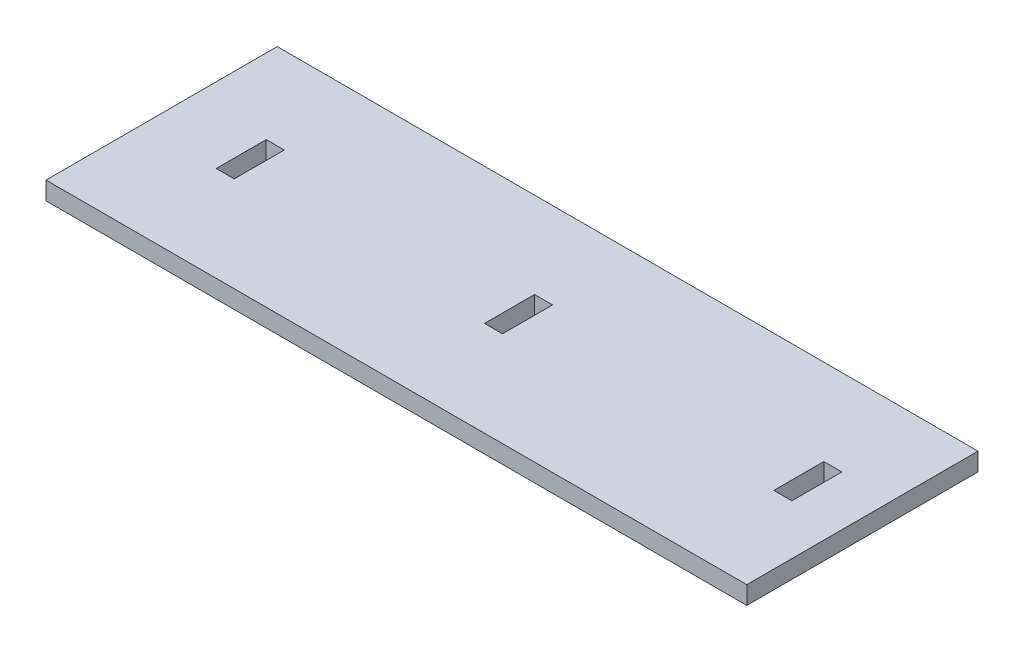
ISO-10303-21;
HEADER;
FILE_DESCRIPTION(('STEP AP214'),'2;1');
FILE_NAME('part.step','',(''),(''),'','','');
FILE_SCHEMA(('AUTOMOTIVE_DESIGN { 1 0 10303 214 1 1 1 1 }'));
ENDSEC;
DATA;
#1=APPLICATION_CONTEXT('core data for automotive mechanical design processes');
#2=APPLICATION_PROTOCOL_DEFINITION('international standard','automotive_design',2000,#1);
#3=PRODUCT_CONTEXT('',#1,'mechanical');
#4=PRODUCT('Part','Part','',(#3));
#5=PRODUCT_RELATED_PRODUCT_CATEGORY('part','',(#4));
#6=PRODUCT_DEFINITION_FORMATION('','',#4);
#7=PRODUCT_DEFINITION_CONTEXT('part definition',#1,'design');
#8=PRODUCT_DEFINITION('design','',#6,#7);
#9=PRODUCT_DEFINITION_SHAPE('','',#8);
#10=(LENGTH_UNIT() NAMED_UNIT(*) SI_UNIT(.MILLI.,.METRE.));
#11=(NAMED_UNIT(*) PLANE_ANGLE_UNIT() SI_UNIT($,.RADIAN.));
#12=(NAMED_UNIT(*) SI_UNIT($,.STERADIAN.) SOLID_ANGLE_UNIT());
#13=UNCERTAINTY_MEASURE_WITH_UNIT(LENGTH_MEASURE(1.E-05),#10,'distance_accuracy_value','');
#14=(GEOMETRIC_REPRESENTATION_CONTEXT(3) GLOBAL_UNCERTAINTY_ASSIGNED_CONTEXT((#13)) GLOBAL_UNIT_ASSIGNED_CONTEXT((#10,
#11,#12)) REPRESENTATION_CONTEXT('',''));
#15=CARTESIAN_POINT('',(0.,0.,0.));
#16=DIRECTION('',(0.,0.,1.));
#17=DIRECTION('',(1.,0.,0.));
#18=AXIS2_PLACEMENT_3D('',#15,#16,#17);
#19=CARTESIAN_POINT('',(0.,4.572,0.));
#20=DIRECTION('',(0.,-1.,0.));
#21=DIRECTION('',(0.,0.,-1.));
#22=AXIS2_PLACEMENT_3D('',#19,#20,#21);
#23=PLANE('',#22);
#24=DIRECTION('',(0.,0.,-1.));
#25=VECTOR('',#24,1.);
#26=CARTESIAN_POINT('',(91.694,4.572,-24.13));
#27=LINE('',#26,#25);
#28=CARTESIAN_POINT('',(91.694,4.572,-24.13));
#29=VERTEX_POINT('',#28);
#30=CARTESIAN_POINT('',(91.694,4.572,-36.83));
#31=VERTEX_POINT('',#30);
#32=EDGE_CURVE('E207',#29,#31,#27,.T.);
#33=ORIENTED_EDGE('',*,*,#32,.F.);
#34=DIRECTION('',(1.,0.,0.));
#35=VECTOR('',#34,1.);
#36=CARTESIAN_POINT('',(91.694,4.572,-24.13));
#37=LINE('',#36,#35);
#38=CARTESIAN_POINT('',(87.122,4.572,-24.13));
#39=VERTEX_POINT('',#38);
#40=EDGE_CURVE('E218',#39,#29,#37,.T.);
#41=ORIENTED_EDGE('',*,*,#40,.F.);
#42=DIRECTION('',(0.,0.,1.));
#43=VECTOR('',#42,1.);
#44=CARTESIAN_POINT('',(87.122,4.572,-24.13));
#45=LINE('',#44,#43);
#46=CARTESIAN_POINT('',(87.122,4.572,-36.83));
#47=VERTEX_POINT('',#46);
#48=EDGE_CURVE('E214',#47,#39,#45,.T.);
#49=ORIENTED_EDGE('',*,*,#48,.F.);
#50=DIRECTION('',(-1.,0.,0.));
#51=VECTOR('',#50,1.);
#52=CARTESIAN_POINT('',(91.694,4.572,-36.83));
#53=LINE('',#52,#51);
#54=EDGE_CURVE('E210',#31,#47,#53,.T.);
#55=ORIENTED_EDGE('',*,*,#54,.F.);
#56=EDGE_LOOP('',(#33,#41,#49,#55));
#57=FACE_BOUND('',#56,.T.);
#58=DIRECTION('',(0.,0.,1.));
#59=VECTOR('',#58,1.);
#60=CARTESIAN_POINT('',(0.,4.572,0.));
#61=LINE('',#60,#59);
#62=CARTESIAN_POINT('',(0.,4.572,-58.674));
#63=VERTEX_POINT('',#62);
#64=CARTESIAN_POINT('',(0.,4.572,0.));
#65=VERTEX_POINT('',#64);
#66=EDGE_CURVE('E293',#63,#65,#61,.T.);
#67=ORIENTED_EDGE('',*,*,#66,.T.);
#68=DIRECTION('',(1.,0.,0.));
#69=VECTOR('',#68,1.);
#70=CARTESIAN_POINT('',(0.,4.572,0.));
#71=LINE('',#70,#69);
#72=CARTESIAN_POINT('',(177.8,4.572,0.));
#73=VERTEX_POINT('',#72);
#74=EDGE_CURVE('E297',#65,#73,#71,.T.);
#75=ORIENTED_EDGE('',*,*,#74,.T.);
#76=DIRECTION('',(0.,0.,-1.));
#77=VECTOR('',#76,1.);
#78=CARTESIAN_POINT('',(177.8,4.572,0.));
#79=LINE('',#78,#77);
#80=CARTESIAN_POINT('',(177.8,4.572,-58.674));
#81=VERTEX_POINT('',#80);
#82=EDGE_CURVE('E301',#73,#81,#79,.T.);
#83=ORIENTED_EDGE('',*,*,#82,.T.);
#84=DIRECTION('',(-1.,0.,0.));
#85=VECTOR('',#84,1.);
#86=CARTESIAN_POINT('',(0.,4.572,-58.674));
#87=LINE('',#86,#85);
#88=EDGE_CURVE('E304',#81,#63,#87,.T.);
#89=ORIENTED_EDGE('',*,*,#88,.T.);
#90=EDGE_LOOP('',(#67,#75,#83,#89));
#91=FACE_BOUND('',#90,.T.);
#92=DIRECTION('',(0.,0.,-1.));
#93=VECTOR('',#92,1.);
#94=CARTESIAN_POINT('',(23.622,4.572,-24.13));
#95=LINE('',#94,#93);
#96=CARTESIAN_POINT('',(23.622,4.572,-24.13));
#97=VERTEX_POINT('',#96);
#98=CARTESIAN_POINT('',(23.622,4.572,-36.83));
#99=VERTEX_POINT('',#98);
#100=EDGE_CURVE('E250',#97,#99,#95,.T.);
#101=ORIENTED_EDGE('',*,*,#100,.F.);
#102=DIRECTION('',(1.,0.,0.));
#103=VECTOR('',#102,1.);
#104=CARTESIAN_POINT('',(23.622,4.572,-24.13));
#105=LINE('',#104,#103);
#106=CARTESIAN_POINT('',(19.05,4.572,-24.13));
#107=VERTEX_POINT('',#106);
#108=EDGE_CURVE('E261',#107,#97,#105,.T.);
#109=ORIENTED_EDGE('',*,*,#108,.F.);
#110=DIRECTION('',(0.,0.,1.));
#111=VECTOR('',#110,1.);
#112=CARTESIAN_POINT('',(19.05,4.572,-24.13));
#113=LINE('',#112,#111);
#114=CARTESIAN_POINT('',(19.05,4.572,-36.83));
#115=VERTEX_POINT('',#114);
#116=EDGE_CURVE('E257',#115,#107,#113,.T.);
#117=ORIENTED_EDGE('',*,*,#116,.F.);
#118=DIRECTION('',(-1.,0.,0.));
#119=VECTOR('',#118,1.);
#120=CARTESIAN_POINT('',(23.622,4.572,-36.83));
#121=LINE('',#120,#119);
#122=EDGE_CURVE('E253',#99,#115,#121,.T.);
#123=ORIENTED_EDGE('',*,*,#122,.F.);
#124=EDGE_LOOP('',(#101,#109,#117,#123));
#125=FACE_BOUND('',#124,.T.);
#126=DIRECTION('',(0.,0.,-1.));
#127=VECTOR('',#126,1.);
#128=CARTESIAN_POINT('',(165.1,4.572,-24.13));
#129=LINE('',#128,#127);
#130=CARTESIAN_POINT('',(165.1,4.572,-24.13));
#131=VERTEX_POINT('',#130);
#132=CARTESIAN_POINT('',(165.1,4.572,-36.83));
#133=VERTEX_POINT('',#132);
#134=EDGE_CURVE('E159',#131,#133,#129,.T.);
#135=ORIENTED_EDGE('',*,*,#134,.F.);
#136=DIRECTION('',(1.,0.,0.));
#137=VECTOR('',#136,1.);
#138=CARTESIAN_POINT('',(165.1,4.572,-24.13));
#139=LINE('',#138,#137);
#140=CARTESIAN_POINT('',(160.528,4.572,-24.13));
#141=VERTEX_POINT('',#140);
#142=EDGE_CURVE('E185',#141,#131,#139,.T.);
#143=ORIENTED_EDGE('',*,*,#142,.F.);
#144=DIRECTION('',(0.,0.,1.));
#145=VECTOR('',#144,1.);
#146=CARTESIAN_POINT('',(160.528,4.572,-24.13));
#147=LINE('',#146,#145);
#148=CARTESIAN_POINT('',(160.528,4.572,-36.83));
#149=VERTEX_POINT('',#148);
#150=EDGE_CURVE('E181',#149,#141,#147,.T.);
#151=ORIENTED_EDGE('',*,*,#150,.F.);
#152=DIRECTION('',(-1.,0.,0.));
#153=VECTOR('',#152,1.);
#154=CARTESIAN_POINT('',(165.1,4.572,-36.83));
#155=LINE('',#154,#153);
#156=EDGE_CURVE('E168',#133,#149,#155,.T.);
#157=ORIENTED_EDGE('',*,*,#156,.F.);
#158=EDGE_LOOP('',(#135,#143,#151,#157));
#159=FACE_BOUND('',#158,.T.);
#160=ADVANCED_FACE('F45',(#57,#91,#125,#159),#23,.F.);
#161=CARTESIAN_POINT('',(0.,0.,0.));
#162=DIRECTION('',(0.,-1.,0.));
#163=DIRECTION('',(0.,0.,-1.));
#164=AXIS2_PLACEMENT_3D('',#161,#162,#163);
#165=PLANE('',#164);
#166=DIRECTION('',(0.,0.,1.));
#167=VECTOR('',#166,1.);
#168=CARTESIAN_POINT('',(0.,0.,0.));
#169=LINE('',#168,#167);
#170=CARTESIAN_POINT('',(0.,0.,-58.674));
#171=VERTEX_POINT('',#170);
#172=CARTESIAN_POINT('',(0.,0.,0.));
#173=VERTEX_POINT('',#172);
#174=EDGE_CURVE('E292',#171,#173,#169,.T.);
#175=ORIENTED_EDGE('',*,*,#174,.F.);
#176=DIRECTION('',(-1.,0.,0.));
#177=VECTOR('',#176,1.);
#178=CARTESIAN_POINT('',(0.,0.,-58.674));
#179=LINE('',#178,#177);
#180=CARTESIAN_POINT('',(177.8,0.,-58.674));
#181=VERTEX_POINT('',#180);
#182=EDGE_CURVE('E298',#181,#171,#179,.T.);
#183=ORIENTED_EDGE('',*,*,#182,.F.);
#184=DIRECTION('',(0.,0.,-1.));
#185=VECTOR('',#184,1.);
#186=CARTESIAN_POINT('',(177.8,0.,0.));
#187=LINE('',#186,#185);
#188=CARTESIAN_POINT('',(177.8,0.,0.));
#189=VERTEX_POINT('',#188);
#190=EDGE_CURVE('E314',#189,#181,#187,.T.);
#191=ORIENTED_EDGE('',*,*,#190,.F.);
#192=DIRECTION('',(1.,0.,0.));
#193=VECTOR('',#192,1.);
#194=CARTESIAN_POINT('',(0.,0.,0.));
#195=LINE('',#194,#193);
#196=EDGE_CURVE('E311',#173,#189,#195,.T.);
#197=ORIENTED_EDGE('',*,*,#196,.F.);
#198=EDGE_LOOP('',(#175,#183,#191,#197));
#199=FACE_BOUND('',#198,.T.);
#200=DIRECTION('',(1.,0.,0.));
#201=VECTOR('',#200,1.);
#202=CARTESIAN_POINT('',(23.622,0.,-24.13));
#203=LINE('',#202,#201);
#204=CARTESIAN_POINT('',(19.05,0.,-24.13));
#205=VERTEX_POINT('',#204);
#206=CARTESIAN_POINT('',(23.622,0.,-24.13));
#207=VERTEX_POINT('',#206);
#208=EDGE_CURVE('E254',#205,#207,#203,.T.);
#209=ORIENTED_EDGE('',*,*,#208,.T.);
#210=DIRECTION('',(0.,0.,-1.));
#211=VECTOR('',#210,1.);
#212=CARTESIAN_POINT('',(23.622,0.,-24.13));
#213=LINE('',#212,#211);
#214=CARTESIAN_POINT('',(23.622,0.,-36.83));
#215=VERTEX_POINT('',#214);
#216=EDGE_CURVE('E249',#207,#215,#213,.T.);
#217=ORIENTED_EDGE('',*,*,#216,.T.);
#218=DIRECTION('',(-1.,0.,0.));
#219=VECTOR('',#218,1.);
#220=CARTESIAN_POINT('',(23.622,0.,-36.83));
#221=LINE('',#220,#219);
#222=CARTESIAN_POINT('',(19.05,0.,-36.83));
#223=VERTEX_POINT('',#222);
#224=EDGE_CURVE('E268',#215,#223,#221,.T.);
#225=ORIENTED_EDGE('',*,*,#224,.T.);
#226=DIRECTION('',(0.,0.,1.));
#227=VECTOR('',#226,1.);
#228=CARTESIAN_POINT('',(19.05,0.,-24.13));
#229=LINE('',#228,#227);
#230=EDGE_CURVE('E272',#223,#205,#229,.T.);
#231=ORIENTED_EDGE('',*,*,#230,.T.);
#232=EDGE_LOOP('',(#209,#217,#225,#231));
#233=FACE_BOUND('',#232,.T.);
#234=DIRECTION('',(1.,0.,0.));
#235=VECTOR('',#234,1.);
#236=CARTESIAN_POINT('',(91.694,0.,-24.13));
#237=LINE('',#236,#235);
#238=CARTESIAN_POINT('',(87.122,0.,-24.13));
#239=VERTEX_POINT('',#238);
#240=CARTESIAN_POINT('',(91.694,0.,-24.13));
#241=VERTEX_POINT('',#240);
#242=EDGE_CURVE('E211',#239,#241,#237,.T.);
#243=ORIENTED_EDGE('',*,*,#242,.T.);
#244=DIRECTION('',(0.,0.,-1.));
#245=VECTOR('',#244,1.);
#246=CARTESIAN_POINT('',(91.694,0.,-24.13));
#247=LINE('',#246,#245);
#248=CARTESIAN_POINT('',(91.694,0.,-36.83));
#249=VERTEX_POINT('',#248);
#250=EDGE_CURVE('E177',#241,#249,#247,.T.);
#251=ORIENTED_EDGE('',*,*,#250,.T.);
#252=DIRECTION('',(-1.,0.,0.));
#253=VECTOR('',#252,1.);
#254=CARTESIAN_POINT('',(91.694,0.,-36.83));
#255=LINE('',#254,#253);
#256=CARTESIAN_POINT('',(87.122,0.,-36.83));
#257=VERTEX_POINT('',#256);
#258=EDGE_CURVE('E225',#249,#257,#255,.T.);
#259=ORIENTED_EDGE('',*,*,#258,.T.);
#260=DIRECTION('',(0.,0.,1.));
#261=VECTOR('',#260,1.);
#262=CARTESIAN_POINT('',(87.122,0.,-24.13));
#263=LINE('',#262,#261);
#264=EDGE_CURVE('E229',#257,#239,#263,.T.);
#265=ORIENTED_EDGE('',*,*,#264,.T.);
#266=EDGE_LOOP('',(#243,#251,#259,#265));
#267=FACE_BOUND('',#266,.T.);
#268=DIRECTION('',(1.,0.,0.));
#269=VECTOR('',#268,1.);
#270=CARTESIAN_POINT('',(165.1,0.,-24.13));
#271=LINE('',#270,#269);
#272=CARTESIAN_POINT('',(160.528,0.,-24.13));
#273=VERTEX_POINT('',#272);
#274=CARTESIAN_POINT('',(165.1,0.,-24.13));
#275=VERTEX_POINT('',#274);
#276=EDGE_CURVE('E169',#273,#275,#271,.T.);
#277=ORIENTED_EDGE('',*,*,#276,.T.);
#278=DIRECTION('',(0.,0.,-1.));
#279=VECTOR('',#278,1.);
#280=CARTESIAN_POINT('',(165.1,0.,-24.13));
#281=LINE('',#280,#279);
#282=CARTESIAN_POINT('',(165.1,0.,-36.83));
#283=VERTEX_POINT('',#282);
#284=EDGE_CURVE('E69',#275,#283,#281,.T.);
#285=ORIENTED_EDGE('',*,*,#284,.T.);
#286=DIRECTION('',(-1.,0.,0.));
#287=VECTOR('',#286,1.);
#288=CARTESIAN_POINT('',(165.1,0.,-36.83));
#289=LINE('',#288,#287);
#290=CARTESIAN_POINT('',(160.528,0.,-36.83));
#291=VERTEX_POINT('',#290);
#292=EDGE_CURVE('E175',#283,#291,#289,.T.);
#293=ORIENTED_EDGE('',*,*,#292,.T.);
#294=DIRECTION('',(0.,0.,1.));
#295=VECTOR('',#294,1.);
#296=CARTESIAN_POINT('',(160.528,0.,-24.13));
#297=LINE('',#296,#295);
#298=EDGE_CURVE('E194',#291,#273,#297,.T.);
#299=ORIENTED_EDGE('',*,*,#298,.T.);
#300=EDGE_LOOP('',(#277,#285,#293,#299));
#301=FACE_BOUND('',#300,.T.);
#302=ADVANCED_FACE('F337',(#199,#233,#267,#301),#165,.T.);
#303=CARTESIAN_POINT('',(0.,4.572,0.));
#304=DIRECTION('',(1.,0.,0.));
#305=DIRECTION('',(0.,0.,-1.));
#306=AXIS2_PLACEMENT_3D('',#303,#304,#305);
#307=PLANE('',#306);
#308=ORIENTED_EDGE('',*,*,#174,.T.);
#309=DIRECTION('',(0.,-1.,0.));
#310=VECTOR('',#309,1.);
#311=CARTESIAN_POINT('',(0.,4.572,0.));
#312=LINE('',#311,#310);
#313=EDGE_CURVE('E11',#65,#173,#312,.T.);
#314=ORIENTED_EDGE('',*,*,#313,.F.);
#315=ORIENTED_EDGE('',*,*,#66,.F.);
#316=DIRECTION('',(0.,-1.,0.));
#317=VECTOR('',#316,1.);
#318=CARTESIAN_POINT('',(0.,4.572,-58.674));
#319=LINE('',#318,#317);
#320=EDGE_CURVE('E307',#63,#171,#319,.T.);
#321=ORIENTED_EDGE('',*,*,#320,.T.);
#322=EDGE_LOOP('',(#308,#314,#315,#321));
#323=FACE_BOUND('',#322,.T.);
#324=ADVANCED_FACE('F47',(#323),#307,.F.);
#325=CARTESIAN_POINT('',(0.,4.572,0.));
#326=DIRECTION('',(0.,0.,-1.));
#327=DIRECTION('',(-1.,0.,0.));
#328=AXIS2_PLACEMENT_3D('',#325,#326,#327);
#329=PLANE('',#328);
#330=ORIENTED_EDGE('',*,*,#196,.T.);
#331=DIRECTION('',(0.,-1.,0.));
#332=VECTOR('',#331,1.);
#333=CARTESIAN_POINT('',(177.8,4.572,0.));
#334=LINE('',#333,#332);
#335=EDGE_CURVE('E54',#73,#189,#334,.T.);
#336=ORIENTED_EDGE('',*,*,#335,.F.);
#337=ORIENTED_EDGE('',*,*,#74,.F.);
#338=ORIENTED_EDGE('',*,*,#313,.T.);
#339=EDGE_LOOP('',(#330,#336,#337,#338));
#340=FACE_BOUND('',#339,.T.);
#341=ADVANCED_FACE('F348',(#340),#329,.F.);
#342=CARTESIAN_POINT('',(177.8,4.572,0.));
#343=DIRECTION('',(-1.,0.,0.));
#344=DIRECTION('',(0.,0.,1.));
#345=AXIS2_PLACEMENT_3D('',#342,#343,#344);
#346=PLANE('',#345);
#347=ORIENTED_EDGE('',*,*,#190,.T.);
#348=DIRECTION('',(0.,-1.,0.));
#349=VECTOR('',#348,1.);
#350=CARTESIAN_POINT('',(177.8,4.572,-58.674));
#351=LINE('',#350,#349);
#352=EDGE_CURVE('E322',#81,#181,#351,.T.);
#353=ORIENTED_EDGE('',*,*,#352,.F.);
#354=ORIENTED_EDGE('',*,*,#82,.F.);
#355=ORIENTED_EDGE('',*,*,#335,.T.);
#356=EDGE_LOOP('',(#347,#353,#354,#355));
#357=FACE_BOUND('',#356,.T.);
#358=ADVANCED_FACE('F331',(#357),#346,.F.);
#359=CARTESIAN_POINT('',(0.,4.572,-58.674));
#360=DIRECTION('',(0.,0.,1.));
#361=DIRECTION('',(1.,0.,0.));
#362=AXIS2_PLACEMENT_3D('',#359,#360,#361);
#363=PLANE('',#362);
#364=ORIENTED_EDGE('',*,*,#182,.T.);
#365=ORIENTED_EDGE('',*,*,#320,.F.);
#366=ORIENTED_EDGE('',*,*,#88,.F.);
#367=ORIENTED_EDGE('',*,*,#352,.T.);
#368=EDGE_LOOP('',(#364,#365,#366,#367));
#369=FACE_BOUND('',#368,.T.);
#370=ADVANCED_FACE('F341',(#369),#363,.F.);
#371=CARTESIAN_POINT('',(23.622,4.572,-24.13));
#372=DIRECTION('',(-1.,0.,0.));
#373=DIRECTION('',(0.,0.,1.));
#374=AXIS2_PLACEMENT_3D('',#371,#372,#373);
#375=PLANE('',#374);
#376=ORIENTED_EDGE('',*,*,#216,.F.);
#377=DIRECTION('',(0.,-1.,0.));
#378=VECTOR('',#377,1.);
#379=CARTESIAN_POINT('',(23.622,4.572,-24.13));
#380=LINE('',#379,#378);
#381=EDGE_CURVE('E264',#97,#207,#380,.T.);
#382=ORIENTED_EDGE('',*,*,#381,.F.);
#383=ORIENTED_EDGE('',*,*,#100,.T.);
#384=DIRECTION('',(0.,-1.,0.));
#385=VECTOR('',#384,1.);
#386=CARTESIAN_POINT('',(23.622,4.572,-36.83));
#387=LINE('',#386,#385);
#388=EDGE_CURVE('E288',#99,#215,#387,.T.);
#389=ORIENTED_EDGE('',*,*,#388,.T.);
#390=EDGE_LOOP('',(#376,#382,#383,#389));
#391=FACE_BOUND('',#390,.T.);
#392=ADVANCED_FACE('F364',(#391),#375,.T.);
#393=CARTESIAN_POINT('',(23.622,4.572,-36.83));
#394=DIRECTION('',(0.,0.,1.));
#395=DIRECTION('',(1.,0.,0.));
#396=AXIS2_PLACEMENT_3D('',#393,#394,#395);
#397=PLANE('',#396);
#398=ORIENTED_EDGE('',*,*,#224,.F.);
#399=ORIENTED_EDGE('',*,*,#388,.F.);
#400=ORIENTED_EDGE('',*,*,#122,.T.);
#401=DIRECTION('',(0.,-1.,0.));
#402=VECTOR('',#401,1.);
#403=CARTESIAN_POINT('',(19.05,4.572,-36.83));
#404=LINE('',#403,#402);
#405=EDGE_CURVE('E285',#115,#223,#404,.T.);
#406=ORIENTED_EDGE('',*,*,#405,.T.);
#407=EDGE_LOOP('',(#398,#399,#400,#406));
#408=FACE_BOUND('',#407,.T.);
#409=ADVANCED_FACE('F371',(#408),#397,.T.);
#410=CARTESIAN_POINT('',(19.05,4.572,-24.13));
#411=DIRECTION('',(1.,0.,0.));
#412=DIRECTION('',(0.,0.,-1.));
#413=AXIS2_PLACEMENT_3D('',#410,#411,#412);
#414=PLANE('',#413);
#415=ORIENTED_EDGE('',*,*,#230,.F.);
#416=ORIENTED_EDGE('',*,*,#405,.F.);
#417=ORIENTED_EDGE('',*,*,#116,.T.);
#418=DIRECTION('',(0.,-1.,0.));
#419=VECTOR('',#418,1.);
#420=CARTESIAN_POINT('',(19.05,4.572,-24.13));
#421=LINE('',#420,#419);
#422=EDGE_CURVE('E282',#107,#205,#421,.T.);
#423=ORIENTED_EDGE('',*,*,#422,.T.);
#424=EDGE_LOOP('',(#415,#416,#417,#423));
#425=FACE_BOUND('',#424,.T.);
#426=ADVANCED_FACE('F376',(#425),#414,.T.);
#427=CARTESIAN_POINT('',(23.622,4.572,-24.13));
#428=DIRECTION('',(0.,0.,-1.));
#429=DIRECTION('',(-1.,0.,0.));
#430=AXIS2_PLACEMENT_3D('',#427,#428,#429);
#431=PLANE('',#430);
#432=ORIENTED_EDGE('',*,*,#208,.F.);
#433=ORIENTED_EDGE('',*,*,#422,.F.);
#434=ORIENTED_EDGE('',*,*,#108,.T.);
#435=ORIENTED_EDGE('',*,*,#381,.T.);
#436=EDGE_LOOP('',(#432,#433,#434,#435));
#437=FACE_BOUND('',#436,.T.);
#438=ADVANCED_FACE('F383',(#437),#431,.T.);
#439=CARTESIAN_POINT('',(91.694,4.572,-24.13));
#440=DIRECTION('',(-1.,0.,0.));
#441=DIRECTION('',(0.,0.,1.));
#442=AXIS2_PLACEMENT_3D('',#439,#440,#441);
#443=PLANE('',#442);
#444=ORIENTED_EDGE('',*,*,#250,.F.);
#445=DIRECTION('',(0.,-1.,0.));
#446=VECTOR('',#445,1.);
#447=CARTESIAN_POINT('',(91.694,4.572,-24.13));
#448=LINE('',#447,#446);
#449=EDGE_CURVE('E221',#29,#241,#448,.T.);
#450=ORIENTED_EDGE('',*,*,#449,.F.);
#451=ORIENTED_EDGE('',*,*,#32,.T.);
#452=DIRECTION('',(0.,-1.,0.));
#453=VECTOR('',#452,1.);
#454=CARTESIAN_POINT('',(91.694,4.572,-36.83));
#455=LINE('',#454,#453);
#456=EDGE_CURVE('E245',#31,#249,#455,.T.);
#457=ORIENTED_EDGE('',*,*,#456,.T.);
#458=EDGE_LOOP('',(#444,#450,#451,#457));
#459=FACE_BOUND('',#458,.T.);
#460=ADVANCED_FACE('F396',(#459),#443,.T.);
#461=CARTESIAN_POINT('',(91.694,4.572,-36.83));
#462=DIRECTION('',(0.,0.,1.));
#463=DIRECTION('',(1.,0.,0.));
#464=AXIS2_PLACEMENT_3D('',#461,#462,#463);
#465=PLANE('',#464);
#466=ORIENTED_EDGE('',*,*,#258,.F.);
#467=ORIENTED_EDGE('',*,*,#456,.F.);
#468=ORIENTED_EDGE('',*,*,#54,.T.);
#469=DIRECTION('',(0.,-1.,0.));
#470=VECTOR('',#469,1.);
#471=CARTESIAN_POINT('',(87.122,4.572,-36.83));
#472=LINE('',#471,#470);
#473=EDGE_CURVE('E242',#47,#257,#472,.T.);
#474=ORIENTED_EDGE('',*,*,#473,.T.);
#475=EDGE_LOOP('',(#466,#467,#468,#474));
#476=FACE_BOUND('',#475,.T.);
#477=ADVANCED_FACE('F401',(#476),#465,.T.);
#478=CARTESIAN_POINT('',(87.122,4.572,-24.13));
#479=DIRECTION('',(1.,0.,0.));
#480=DIRECTION('',(0.,0.,-1.));
#481=AXIS2_PLACEMENT_3D('',#478,#479,#480);
#482=PLANE('',#481);
#483=ORIENTED_EDGE('',*,*,#264,.F.);
#484=ORIENTED_EDGE('',*,*,#473,.F.);
#485=ORIENTED_EDGE('',*,*,#48,.T.);
#486=DIRECTION('',(0.,-1.,0.));
#487=VECTOR('',#486,1.);
#488=CARTESIAN_POINT('',(87.122,4.572,-24.13));
#489=LINE('',#488,#487);
#490=EDGE_CURVE('E239',#39,#239,#489,.T.);
#491=ORIENTED_EDGE('',*,*,#490,.T.);
#492=EDGE_LOOP('',(#483,#484,#485,#491));
#493=FACE_BOUND('',#492,.T.);
#494=ADVANCED_FACE('F405',(#493),#482,.T.);
#495=CARTESIAN_POINT('',(91.694,4.572,-24.13));
#496=DIRECTION('',(0.,0.,-1.));
#497=DIRECTION('',(-1.,0.,0.));
#498=AXIS2_PLACEMENT_3D('',#495,#496,#497);
#499=PLANE('',#498);
#500=ORIENTED_EDGE('',*,*,#242,.F.);
#501=ORIENTED_EDGE('',*,*,#490,.F.);
#502=ORIENTED_EDGE('',*,*,#40,.T.);
#503=ORIENTED_EDGE('',*,*,#449,.T.);
#504=EDGE_LOOP('',(#500,#501,#502,#503));
#505=FACE_BOUND('',#504,.T.);
#506=ADVANCED_FACE('F409',(#505),#499,.T.);
#507=CARTESIAN_POINT('',(165.1,4.572,-24.13));
#508=DIRECTION('',(-1.,0.,0.));
#509=DIRECTION('',(0.,0.,1.));
#510=AXIS2_PLACEMENT_3D('',#507,#508,#509);
#511=PLANE('',#510);
#512=ORIENTED_EDGE('',*,*,#284,.F.);
#513=DIRECTION('',(0.,-1.,0.));
#514=VECTOR('',#513,1.);
#515=CARTESIAN_POINT('',(165.1,4.572,-24.13));
#516=LINE('',#515,#514);
#517=EDGE_CURVE('E163',#131,#275,#516,.T.);
#518=ORIENTED_EDGE('',*,*,#517,.F.);
#519=ORIENTED_EDGE('',*,*,#134,.T.);
#520=DIRECTION('',(0.,-1.,0.));
#521=VECTOR('',#520,1.);
#522=CARTESIAN_POINT('',(165.1,4.572,-36.83));
#523=LINE('',#522,#521);
#524=EDGE_CURVE('E162',#133,#283,#523,.T.);
#525=ORIENTED_EDGE('',*,*,#524,.T.);
#526=EDGE_LOOP('',(#512,#518,#519,#525));
#527=FACE_BOUND('',#526,.T.);
#528=ADVANCED_FACE('F161',(#527),#511,.T.);
#529=CARTESIAN_POINT('',(165.1,4.572,-36.83));
#530=DIRECTION('',(0.,0.,1.));
#531=DIRECTION('',(1.,0.,0.));
#532=AXIS2_PLACEMENT_3D('',#529,#530,#531);
#533=PLANE('',#532);
#534=ORIENTED_EDGE('',*,*,#292,.F.);
#535=ORIENTED_EDGE('',*,*,#524,.F.);
#536=ORIENTED_EDGE('',*,*,#156,.T.);
#537=DIRECTION('',(0.,-1.,0.));
#538=VECTOR('',#537,1.);
#539=CARTESIAN_POINT('',(160.528,4.572,-36.83));
#540=LINE('',#539,#538);
#541=EDGE_CURVE('E178',#149,#291,#540,.T.);
#542=ORIENTED_EDGE('',*,*,#541,.T.);
#543=EDGE_LOOP('',(#534,#535,#536,#542));
#544=FACE_BOUND('',#543,.T.);
#545=ADVANCED_FACE('F172',(#544),#533,.T.);
#546=CARTESIAN_POINT('',(160.528,4.572,-24.13));
#547=DIRECTION('',(1.,0.,0.));
#548=DIRECTION('',(0.,0.,-1.));
#549=AXIS2_PLACEMENT_3D('',#546,#547,#548);
#550=PLANE('',#549);
#551=ORIENTED_EDGE('',*,*,#298,.F.);
#552=ORIENTED_EDGE('',*,*,#541,.F.);
#553=ORIENTED_EDGE('',*,*,#150,.T.);
#554=DIRECTION('',(0.,-1.,0.));
#555=VECTOR('',#554,1.);
#556=CARTESIAN_POINT('',(160.528,4.572,-24.13));
#557=LINE('',#556,#555);
#558=EDGE_CURVE('E61',#141,#273,#557,.T.);
#559=ORIENTED_EDGE('',*,*,#558,.T.);
#560=EDGE_LOOP('',(#551,#552,#553,#559));
#561=FACE_BOUND('',#560,.T.);
#562=ADVANCED_FACE('F418',(#561),#550,.T.);
#563=CARTESIAN_POINT('',(165.1,4.572,-24.13));
#564=DIRECTION('',(0.,0.,-1.));
#565=DIRECTION('',(-1.,0.,0.));
#566=AXIS2_PLACEMENT_3D('',#563,#564,#565);
#567=PLANE('',#566);
#568=ORIENTED_EDGE('',*,*,#276,.F.);
#569=ORIENTED_EDGE('',*,*,#558,.F.);
#570=ORIENTED_EDGE('',*,*,#142,.T.);
#571=ORIENTED_EDGE('',*,*,#517,.T.);
#572=EDGE_LOOP('',(#568,#569,#570,#571));
#573=FACE_BOUND('',#572,.T.);
#574=ADVANCED_FACE('F421',(#573),#567,.T.);
#575=CLOSED_SHELL('',(#160,#302,#324,#341,#358,#370,#392,#409,#426,#438,#460,#477,#494,#506,
#528,#545,#562,#574));
#576=MANIFOLD_SOLID_BREP('B2',#575);
#577=ADVANCED_BREP_SHAPE_REPRESENTATION('',(#18,#576),#14);
#578=SHAPE_DEFINITION_REPRESENTATION(#9,#577);
ENDSEC;
END-ISO-10303-21;
